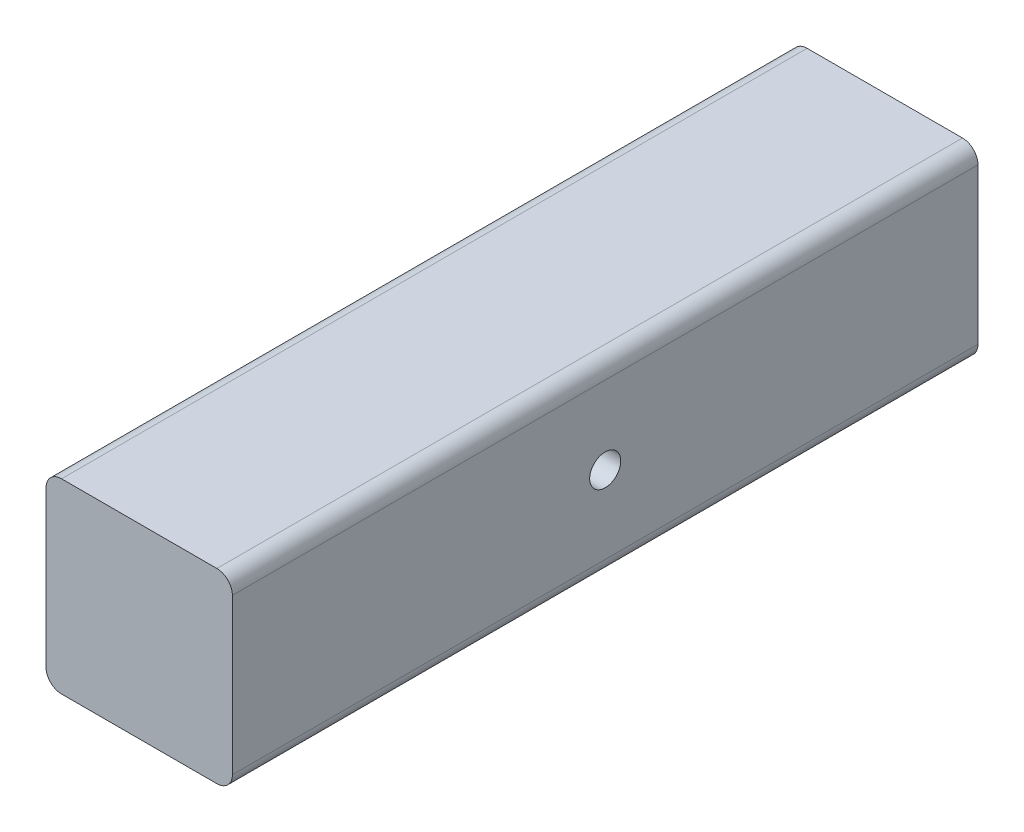
ISO-10303-21;
HEADER;
FILE_DESCRIPTION(('STEP AP214'),'2;1');
FILE_NAME('part.step','',(''),(''),'','','');
FILE_SCHEMA(('AUTOMOTIVE_DESIGN { 1 0 10303 214 1 1 1 1 }'));
ENDSEC;
DATA;
#1=APPLICATION_CONTEXT('core data for automotive mechanical design processes');
#2=APPLICATION_PROTOCOL_DEFINITION('international standard','automotive_design',2000,#1);
#3=PRODUCT_CONTEXT('',#1,'mechanical');
#4=PRODUCT('Part','Part','',(#3));
#5=PRODUCT_RELATED_PRODUCT_CATEGORY('part','',(#4));
#6=PRODUCT_DEFINITION_FORMATION('','',#4);
#7=PRODUCT_DEFINITION_CONTEXT('part definition',#1,'design');
#8=PRODUCT_DEFINITION('design','',#6,#7);
#9=PRODUCT_DEFINITION_SHAPE('','',#8);
#10=(LENGTH_UNIT() NAMED_UNIT(*) SI_UNIT(.MILLI.,.METRE.));
#11=(NAMED_UNIT(*) PLANE_ANGLE_UNIT() SI_UNIT($,.RADIAN.));
#12=(NAMED_UNIT(*) SI_UNIT($,.STERADIAN.) SOLID_ANGLE_UNIT());
#13=UNCERTAINTY_MEASURE_WITH_UNIT(LENGTH_MEASURE(1.E-05),#10,'distance_accuracy_value','');
#14=(GEOMETRIC_REPRESENTATION_CONTEXT(3) GLOBAL_UNCERTAINTY_ASSIGNED_CONTEXT((#13)) GLOBAL_UNIT_ASSIGNED_CONTEXT((#10,
#11,#12)) REPRESENTATION_CONTEXT('',''));
#15=CARTESIAN_POINT('',(0.,0.,0.));
#16=DIRECTION('',(0.,0.,1.));
#17=DIRECTION('',(1.,0.,0.));
#18=AXIS2_PLACEMENT_3D('',#15,#16,#17);
#19=CARTESIAN_POINT('',(19.05,-19.05,152.4));
#20=DIRECTION('',(-1.,0.,0.));
#21=DIRECTION('',(0.,0.,1.));
#22=AXIS2_PLACEMENT_3D('',#19,#20,#21);
#23=PLANE('',#22);
#24=CARTESIAN_POINT('',(19.05,0.,76.2));
#25=DIRECTION('',(-1.,0.,0.));
#26=DIRECTION('',(0.,0.,1.));
#27=AXIS2_PLACEMENT_3D('',#24,#25,#26);
#28=CIRCLE('',#27,3.175);
#29=CARTESIAN_POINT('',(19.05,0.,79.375));
#30=VERTEX_POINT('',#29);
#31=EDGE_CURVE('E177',#30,#30,#28,.T.);
#32=ORIENTED_EDGE('',*,*,#31,.T.);
#33=EDGE_LOOP('',(#32));
#34=FACE_BOUND('',#33,.T.);
#35=DIRECTION('',(0.,1.,0.));
#36=VECTOR('',#35,1.);
#37=CARTESIAN_POINT('',(19.05,-19.05,152.4));
#38=LINE('',#37,#36);
#39=CARTESIAN_POINT('',(19.05,-15.875,152.4));
#40=VERTEX_POINT('',#39);
#41=CARTESIAN_POINT('',(19.05,15.875,152.4));
#42=VERTEX_POINT('',#41);
#43=EDGE_CURVE('E134',#40,#42,#38,.T.);
#44=ORIENTED_EDGE('',*,*,#43,.F.);
#45=DIRECTION('',(0.,0.,-1.));
#46=VECTOR('',#45,1.);
#47=CARTESIAN_POINT('',(19.05,-15.875,152.4));
#48=LINE('',#47,#46);
#49=CARTESIAN_POINT('',(19.05,-15.875,0.));
#50=VERTEX_POINT('',#49);
#51=EDGE_CURVE('E11',#40,#50,#48,.T.);
#52=ORIENTED_EDGE('',*,*,#51,.T.);
#53=DIRECTION('',(0.,1.,0.));
#54=VECTOR('',#53,1.);
#55=CARTESIAN_POINT('',(19.05,-19.05,0.));
#56=LINE('',#55,#54);
#57=CARTESIAN_POINT('',(19.05,15.875,0.));
#58=VERTEX_POINT('',#57);
#59=EDGE_CURVE('E136',#50,#58,#56,.T.);
#60=ORIENTED_EDGE('',*,*,#59,.T.);
#61=DIRECTION('',(0.,0.,-1.));
#62=VECTOR('',#61,1.);
#63=CARTESIAN_POINT('',(19.05,15.875,152.4));
#64=LINE('',#63,#62);
#65=EDGE_CURVE('E47',#58,#42,#64,.F.);
#66=ORIENTED_EDGE('',*,*,#65,.T.);
#67=EDGE_LOOP('',(#44,#52,#60,#66));
#68=FACE_BOUND('',#67,.T.);
#69=ADVANCED_FACE('F39',(#34,#68),#23,.F.);
#70=CARTESIAN_POINT('',(-19.05,19.05,152.4));
#71=DIRECTION('',(0.,-1.,0.));
#72=DIRECTION('',(0.,0.,-1.));
#73=AXIS2_PLACEMENT_3D('',#70,#71,#72);
#74=PLANE('',#73);
#75=DIRECTION('',(-1.,0.,0.));
#76=VECTOR('',#75,1.);
#77=CARTESIAN_POINT('',(-19.05,19.05,0.));
#78=LINE('',#77,#76);
#79=CARTESIAN_POINT('',(15.875,19.05,0.));
#80=VERTEX_POINT('',#79);
#81=CARTESIAN_POINT('',(-15.875,19.05,0.));
#82=VERTEX_POINT('',#81);
#83=EDGE_CURVE('E132',#80,#82,#78,.T.);
#84=ORIENTED_EDGE('',*,*,#83,.T.);
#85=DIRECTION('',(0.,0.,-1.));
#86=VECTOR('',#85,1.);
#87=CARTESIAN_POINT('',(-15.875,19.05,152.4));
#88=LINE('',#87,#86);
#89=CARTESIAN_POINT('',(-15.875,19.05,152.4));
#90=VERTEX_POINT('',#89);
#91=EDGE_CURVE('E111',#82,#90,#88,.F.);
#92=ORIENTED_EDGE('',*,*,#91,.T.);
#93=DIRECTION('',(-1.,0.,0.));
#94=VECTOR('',#93,1.);
#95=CARTESIAN_POINT('',(-19.05,19.05,152.4));
#96=LINE('',#95,#94);
#97=CARTESIAN_POINT('',(15.875,19.05,152.4));
#98=VERTEX_POINT('',#97);
#99=EDGE_CURVE('E172',#98,#90,#96,.T.);
#100=ORIENTED_EDGE('',*,*,#99,.F.);
#101=DIRECTION('',(0.,0.,-1.));
#102=VECTOR('',#101,1.);
#103=CARTESIAN_POINT('',(15.875,19.05,152.4));
#104=LINE('',#103,#102);
#105=EDGE_CURVE('E116',#98,#80,#104,.T.);
#106=ORIENTED_EDGE('',*,*,#105,.T.);
#107=EDGE_LOOP('',(#84,#92,#100,#106));
#108=FACE_BOUND('',#107,.T.);
#109=ADVANCED_FACE('F176',(#108),#74,.F.);
#110=CARTESIAN_POINT('',(-19.05,-19.05,152.4));
#111=DIRECTION('',(1.,0.,0.));
#112=DIRECTION('',(0.,0.,-1.));
#113=AXIS2_PLACEMENT_3D('',#110,#111,#112);
#114=PLANE('',#113);
#115=CARTESIAN_POINT('',(-19.05,0.,76.2));
#116=DIRECTION('',(-1.,0.,0.));
#117=DIRECTION('',(0.,0.,1.));
#118=AXIS2_PLACEMENT_3D('',#115,#116,#117);
#119=CIRCLE('',#118,3.175);
#120=CARTESIAN_POINT('',(-19.05,0.,79.375));
#121=VERTEX_POINT('',#120);
#122=EDGE_CURVE('E179',#121,#121,#119,.T.);
#123=ORIENTED_EDGE('',*,*,#122,.F.);
#124=EDGE_LOOP('',(#123));
#125=FACE_BOUND('',#124,.T.);
#126=DIRECTION('',(0.,-1.,0.));
#127=VECTOR('',#126,1.);
#128=CARTESIAN_POINT('',(-19.05,-19.05,152.4));
#129=LINE('',#128,#127);
#130=CARTESIAN_POINT('',(-19.05,15.875,152.4));
#131=VERTEX_POINT('',#130);
#132=CARTESIAN_POINT('',(-19.05,-15.875,152.4));
#133=VERTEX_POINT('',#132);
#134=EDGE_CURVE('E125',#131,#133,#129,.T.);
#135=ORIENTED_EDGE('',*,*,#134,.F.);
#136=DIRECTION('',(0.,0.,-1.));
#137=VECTOR('',#136,1.);
#138=CARTESIAN_POINT('',(-19.05,15.875,152.4));
#139=LINE('',#138,#137);
#140=CARTESIAN_POINT('',(-19.05,15.875,0.));
#141=VERTEX_POINT('',#140);
#142=EDGE_CURVE('E110',#131,#141,#139,.T.);
#143=ORIENTED_EDGE('',*,*,#142,.T.);
#144=DIRECTION('',(0.,-1.,0.));
#145=VECTOR('',#144,1.);
#146=CARTESIAN_POINT('',(-19.05,-19.05,0.));
#147=LINE('',#146,#145);
#148=CARTESIAN_POINT('',(-19.05,-15.875,0.));
#149=VERTEX_POINT('',#148);
#150=EDGE_CURVE('E123',#141,#149,#147,.T.);
#151=ORIENTED_EDGE('',*,*,#150,.T.);
#152=DIRECTION('',(0.,0.,-1.));
#153=VECTOR('',#152,1.);
#154=CARTESIAN_POINT('',(-19.05,-15.875,152.4));
#155=LINE('',#154,#153);
#156=EDGE_CURVE('E127',#149,#133,#155,.F.);
#157=ORIENTED_EDGE('',*,*,#156,.T.);
#158=EDGE_LOOP('',(#135,#143,#151,#157));
#159=FACE_BOUND('',#158,.T.);
#160=ADVANCED_FACE('F122',(#125,#159),#114,.F.);
#161=CARTESIAN_POINT('',(-19.05,-19.05,152.4));
#162=DIRECTION('',(0.,1.,0.));
#163=DIRECTION('',(0.,0.,1.));
#164=AXIS2_PLACEMENT_3D('',#161,#162,#163);
#165=PLANE('',#164);
#166=DIRECTION('',(1.,0.,0.));
#167=VECTOR('',#166,1.);
#168=CARTESIAN_POINT('',(-19.05,-19.05,152.4));
#169=LINE('',#168,#167);
#170=CARTESIAN_POINT('',(-15.875,-19.05,152.4));
#171=VERTEX_POINT('',#170);
#172=CARTESIAN_POINT('',(15.875,-19.05,152.4));
#173=VERTEX_POINT('',#172);
#174=EDGE_CURVE('E140',#171,#173,#169,.T.);
#175=ORIENTED_EDGE('',*,*,#174,.F.);
#176=DIRECTION('',(0.,0.,-1.));
#177=VECTOR('',#176,1.);
#178=CARTESIAN_POINT('',(-15.875,-19.05,152.4));
#179=LINE('',#178,#177);
#180=CARTESIAN_POINT('',(-15.875,-19.05,0.));
#181=VERTEX_POINT('',#180);
#182=EDGE_CURVE('E157',#171,#181,#179,.T.);
#183=ORIENTED_EDGE('',*,*,#182,.T.);
#184=DIRECTION('',(1.,0.,0.));
#185=VECTOR('',#184,1.);
#186=CARTESIAN_POINT('',(-19.05,-19.05,0.));
#187=LINE('',#186,#185);
#188=CARTESIAN_POINT('',(15.875,-19.05,0.));
#189=VERTEX_POINT('',#188);
#190=EDGE_CURVE('E131',#181,#189,#187,.T.);
#191=ORIENTED_EDGE('',*,*,#190,.T.);
#192=DIRECTION('',(0.,0.,-1.));
#193=VECTOR('',#192,1.);
#194=CARTESIAN_POINT('',(15.875,-19.05,152.4));
#195=LINE('',#194,#193);
#196=EDGE_CURVE('E54',#189,#173,#195,.F.);
#197=ORIENTED_EDGE('',*,*,#196,.T.);
#198=EDGE_LOOP('',(#175,#183,#191,#197));
#199=FACE_BOUND('',#198,.T.);
#200=ADVANCED_FACE('F191',(#199),#165,.F.);
#201=CARTESIAN_POINT('',(0.,0.,152.4));
#202=DIRECTION('',(0.,0.,-1.));
#203=DIRECTION('',(-1.,0.,0.));
#204=AXIS2_PLACEMENT_3D('',#201,#202,#203);
#205=PLANE('',#204);
#206=ORIENTED_EDGE('',*,*,#99,.T.);
#207=CARTESIAN_POINT('',(-15.875,15.875,152.4));
#208=DIRECTION('',(0.,0.,-1.));
#209=DIRECTION('',(-1.,0.,0.));
#210=AXIS2_PLACEMENT_3D('',#207,#208,#209);
#211=CIRCLE('',#210,3.175);
#212=EDGE_CURVE('E154',#90,#131,#211,.F.);
#213=ORIENTED_EDGE('',*,*,#212,.T.);
#214=ORIENTED_EDGE('',*,*,#134,.T.);
#215=CARTESIAN_POINT('',(-15.875,-15.875,152.4));
#216=DIRECTION('',(0.,0.,-1.));
#217=DIRECTION('',(-1.,0.,0.));
#218=AXIS2_PLACEMENT_3D('',#215,#216,#217);
#219=CIRCLE('',#218,3.175);
#220=EDGE_CURVE('E61',#133,#171,#219,.F.);
#221=ORIENTED_EDGE('',*,*,#220,.T.);
#222=ORIENTED_EDGE('',*,*,#174,.T.);
#223=CARTESIAN_POINT('',(15.875,-15.875,152.4));
#224=DIRECTION('',(0.,0.,-1.));
#225=DIRECTION('',(-1.,0.,0.));
#226=AXIS2_PLACEMENT_3D('',#223,#224,#225);
#227=CIRCLE('',#226,3.175);
#228=EDGE_CURVE('E151',#173,#40,#227,.F.);
#229=ORIENTED_EDGE('',*,*,#228,.T.);
#230=ORIENTED_EDGE('',*,*,#43,.T.);
#231=CARTESIAN_POINT('',(15.875,15.875,152.4));
#232=DIRECTION('',(0.,0.,-1.));
#233=DIRECTION('',(-1.,0.,0.));
#234=AXIS2_PLACEMENT_3D('',#231,#232,#233);
#235=CIRCLE('',#234,3.175);
#236=EDGE_CURVE('E149',#42,#98,#235,.F.);
#237=ORIENTED_EDGE('',*,*,#236,.T.);
#238=EDGE_LOOP('',(#206,#213,#214,#221,#222,#229,#230,#237));
#239=FACE_BOUND('',#238,.T.);
#240=ADVANCED_FACE('F169',(#239),#205,.F.);
#241=CARTESIAN_POINT('',(0.,0.,0.));
#242=DIRECTION('',(0.,0.,-1.));
#243=DIRECTION('',(-1.,0.,0.));
#244=AXIS2_PLACEMENT_3D('',#241,#242,#243);
#245=PLANE('',#244);
#246=ORIENTED_EDGE('',*,*,#150,.F.);
#247=CARTESIAN_POINT('',(-15.875,15.875,0.));
#248=DIRECTION('',(0.,0.,-1.));
#249=DIRECTION('',(-1.,0.,0.));
#250=AXIS2_PLACEMENT_3D('',#247,#248,#249);
#251=CIRCLE('',#250,3.175);
#252=EDGE_CURVE('E106',#141,#82,#251,.T.);
#253=ORIENTED_EDGE('',*,*,#252,.T.);
#254=ORIENTED_EDGE('',*,*,#83,.F.);
#255=CARTESIAN_POINT('',(15.875,15.875,0.));
#256=DIRECTION('',(0.,0.,-1.));
#257=DIRECTION('',(-1.,0.,0.));
#258=AXIS2_PLACEMENT_3D('',#255,#256,#257);
#259=CIRCLE('',#258,3.175);
#260=EDGE_CURVE('E126',#80,#58,#259,.T.);
#261=ORIENTED_EDGE('',*,*,#260,.T.);
#262=ORIENTED_EDGE('',*,*,#59,.F.);
#263=CARTESIAN_POINT('',(15.875,-15.875,0.));
#264=DIRECTION('',(0.,0.,-1.));
#265=DIRECTION('',(-1.,0.,0.));
#266=AXIS2_PLACEMENT_3D('',#263,#264,#265);
#267=CIRCLE('',#266,3.175);
#268=EDGE_CURVE('E143',#50,#189,#267,.T.);
#269=ORIENTED_EDGE('',*,*,#268,.T.);
#270=ORIENTED_EDGE('',*,*,#190,.F.);
#271=CARTESIAN_POINT('',(-15.875,-15.875,0.));
#272=DIRECTION('',(0.,0.,-1.));
#273=DIRECTION('',(-1.,0.,0.));
#274=AXIS2_PLACEMENT_3D('',#271,#272,#273);
#275=CIRCLE('',#274,3.175);
#276=EDGE_CURVE('E117',#181,#149,#275,.T.);
#277=ORIENTED_EDGE('',*,*,#276,.T.);
#278=EDGE_LOOP('',(#246,#253,#254,#261,#262,#269,#270,#277));
#279=FACE_BOUND('',#278,.T.);
#280=ADVANCED_FACE('F129',(#279),#245,.T.);
#281=CARTESIAN_POINT('',(-15.875,15.875,152.4));
#282=DIRECTION('',(0.,0.,-1.));
#283=DIRECTION('',(-1.,0.,0.));
#284=AXIS2_PLACEMENT_3D('',#281,#282,#283);
#285=CYLINDRICAL_SURFACE('',#284,3.175);
#286=ORIENTED_EDGE('',*,*,#212,.F.);
#287=ORIENTED_EDGE('',*,*,#91,.F.);
#288=ORIENTED_EDGE('',*,*,#252,.F.);
#289=ORIENTED_EDGE('',*,*,#142,.F.);
#290=EDGE_LOOP('',(#286,#287,#288,#289));
#291=FACE_BOUND('',#290,.T.);
#292=ADVANCED_FACE('F109',(#291),#285,.T.);
#293=CARTESIAN_POINT('',(-15.875,-15.875,152.4));
#294=DIRECTION('',(0.,0.,-1.));
#295=DIRECTION('',(-1.,0.,0.));
#296=AXIS2_PLACEMENT_3D('',#293,#294,#295);
#297=CYLINDRICAL_SURFACE('',#296,3.175);
#298=ORIENTED_EDGE('',*,*,#220,.F.);
#299=ORIENTED_EDGE('',*,*,#156,.F.);
#300=ORIENTED_EDGE('',*,*,#276,.F.);
#301=ORIENTED_EDGE('',*,*,#182,.F.);
#302=EDGE_LOOP('',(#298,#299,#300,#301));
#303=FACE_BOUND('',#302,.T.);
#304=ADVANCED_FACE('F209',(#303),#297,.T.);
#305=CARTESIAN_POINT('',(15.875,-15.875,152.4));
#306=DIRECTION('',(0.,0.,-1.));
#307=DIRECTION('',(-1.,0.,0.));
#308=AXIS2_PLACEMENT_3D('',#305,#306,#307);
#309=CYLINDRICAL_SURFACE('',#308,3.175);
#310=ORIENTED_EDGE('',*,*,#228,.F.);
#311=ORIENTED_EDGE('',*,*,#196,.F.);
#312=ORIENTED_EDGE('',*,*,#268,.F.);
#313=ORIENTED_EDGE('',*,*,#51,.F.);
#314=EDGE_LOOP('',(#310,#311,#312,#313));
#315=FACE_BOUND('',#314,.T.);
#316=ADVANCED_FACE('F211',(#315),#309,.T.);
#317=CARTESIAN_POINT('',(15.875,15.875,152.4));
#318=DIRECTION('',(0.,0.,-1.));
#319=DIRECTION('',(-1.,0.,0.));
#320=AXIS2_PLACEMENT_3D('',#317,#318,#319);
#321=CYLINDRICAL_SURFACE('',#320,3.175);
#322=ORIENTED_EDGE('',*,*,#236,.F.);
#323=ORIENTED_EDGE('',*,*,#65,.F.);
#324=ORIENTED_EDGE('',*,*,#260,.F.);
#325=ORIENTED_EDGE('',*,*,#105,.F.);
#326=EDGE_LOOP('',(#322,#323,#324,#325));
#327=FACE_BOUND('',#326,.T.);
#328=ADVANCED_FACE('F41',(#327),#321,.T.);
#329=CARTESIAN_POINT('',(19.05,0.,76.2));
#330=DIRECTION('',(-1.,0.,0.));
#331=DIRECTION('',(0.,0.,1.));
#332=AXIS2_PLACEMENT_3D('',#329,#330,#331);
#333=CYLINDRICAL_SURFACE('',#332,3.175);
#334=CARTESIAN_POINT('',(19.05,0.,79.375));
#335=CARTESIAN_POINT('',(18.653125,0.,79.375));
#336=CARTESIAN_POINT('',(18.25625,0.,79.375));
#337=CARTESIAN_POINT('',(17.4625,0.,79.375));
#338=CARTESIAN_POINT('',(17.065625,0.,79.375));
#339=CARTESIAN_POINT('',(16.271875,0.,79.375));
#340=CARTESIAN_POINT('',(15.875,0.,79.375));
#341=CARTESIAN_POINT('',(15.08125,0.,79.375));
#342=CARTESIAN_POINT('',(14.684375,0.,79.375));
#343=CARTESIAN_POINT('',(13.890625,0.,79.375));
#344=CARTESIAN_POINT('',(13.49375,0.,79.375));
#345=CARTESIAN_POINT('',(12.7,0.,79.375));
#346=CARTESIAN_POINT('',(12.303125,0.,79.375));
#347=CARTESIAN_POINT('',(11.509375,0.,79.375));
#348=CARTESIAN_POINT('',(11.1125,0.,79.375));
#349=CARTESIAN_POINT('',(10.31875,0.,79.375));
#350=CARTESIAN_POINT('',(9.92187500000001,0.,79.375));
#351=CARTESIAN_POINT('',(9.12812500000001,0.,79.375));
#352=CARTESIAN_POINT('',(8.73125,0.,79.375));
#353=CARTESIAN_POINT('',(7.93750000000001,0.,79.375));
#354=CARTESIAN_POINT('',(7.540625,0.,79.375));
#355=CARTESIAN_POINT('',(6.746875,0.,79.375));
#356=CARTESIAN_POINT('',(6.35,0.,79.375));
#357=CARTESIAN_POINT('',(5.55625,0.,79.375));
#358=CARTESIAN_POINT('',(5.15937500000001,0.,79.375));
#359=CARTESIAN_POINT('',(4.365625,0.,79.375));
#360=CARTESIAN_POINT('',(3.96875,0.,79.375));
#361=CARTESIAN_POINT('',(3.17500000000001,0.,79.375));
#362=CARTESIAN_POINT('',(2.77812500000001,0.,79.375));
#363=CARTESIAN_POINT('',(1.98437500000001,0.,79.375));
#364=CARTESIAN_POINT('',(1.58750000000001,0.,79.375));
#365=CARTESIAN_POINT('',(0.793750000000007,0.,79.375));
#366=CARTESIAN_POINT('',(0.396875000000007,0.,79.375));
#367=CARTESIAN_POINT('',(-0.396874999999993,0.,79.375));
#368=CARTESIAN_POINT('',(-0.793749999999994,0.,79.375));
#369=CARTESIAN_POINT('',(-1.58749999999999,0.,79.375));
#370=CARTESIAN_POINT('',(-1.98437499999999,0.,79.375));
#371=CARTESIAN_POINT('',(-2.77812499999999,0.,79.375));
#372=CARTESIAN_POINT('',(-3.17499999999999,0.,79.375));
#373=CARTESIAN_POINT('',(-3.96875,0.,79.375));
#374=CARTESIAN_POINT('',(-4.365625,0.,79.375));
#375=CARTESIAN_POINT('',(-5.15937499999999,0.,79.375));
#376=CARTESIAN_POINT('',(-5.55624999999999,0.,79.375));
#377=CARTESIAN_POINT('',(-6.34999999999999,0.,79.375));
#378=CARTESIAN_POINT('',(-6.74687499999999,0.,79.375));
#379=CARTESIAN_POINT('',(-7.54062499999999,0.,79.375));
#380=CARTESIAN_POINT('',(-7.93749999999999,0.,79.375));
#381=CARTESIAN_POINT('',(-8.73124999999999,0.,79.375));
#382=CARTESIAN_POINT('',(-9.128125,0.,79.375));
#383=CARTESIAN_POINT('',(-9.92187499999999,0.,79.375));
#384=CARTESIAN_POINT('',(-10.31875,0.,79.375));
#385=CARTESIAN_POINT('',(-11.1125,0.,79.375));
#386=CARTESIAN_POINT('',(-11.509375,0.,79.375));
#387=CARTESIAN_POINT('',(-12.303125,0.,79.375));
#388=CARTESIAN_POINT('',(-12.7,0.,79.375));
#389=CARTESIAN_POINT('',(-13.49375,0.,79.375));
#390=CARTESIAN_POINT('',(-13.890625,0.,79.375));
#391=CARTESIAN_POINT('',(-14.684375,0.,79.375));
#392=CARTESIAN_POINT('',(-15.08125,0.,79.375));
#393=CARTESIAN_POINT('',(-15.875,0.,79.375));
#394=CARTESIAN_POINT('',(-16.271875,0.,79.375));
#395=CARTESIAN_POINT('',(-17.065625,0.,79.375));
#396=CARTESIAN_POINT('',(-17.4625,0.,79.375));
#397=CARTESIAN_POINT('',(-18.25625,0.,79.375));
#398=CARTESIAN_POINT('',(-18.653125,0.,79.375));
#399=CARTESIAN_POINT('',(-19.05,0.,79.375));
#400=B_SPLINE_CURVE_WITH_KNOTS('',3,(#334,#335,#336,#337,#338,#339,#340,#341,#342,#343,#344,
#345,#346,#347,#348,#349,#350,#351,#352,#353,#354,#355,#356,#357,#358,#359,#360,#361,#362,#363,
#364,#365,#366,#367,#368,#369,#370,#371,#372,#373,#374,#375,#376,#377,#378,#379,#380,#381,#382,
#383,#384,#385,#386,#387,#388,#389,#390,#391,#392,#393,#394,#395,#396,#397,#398,#399),
.UNSPECIFIED.,.F.,.F.,(4,2,2,2,2,2,2,2,2,2,2,2,2,2,2,2,2,2,2,2,2,2,2,2,2,2,2,2,2,2,2,2,4),(0.,
1.190625,2.38125,3.571875,4.7625,5.953125,7.14375,8.334375,9.525,10.715625,11.90625,13.096875,
14.2875,15.478125,16.66875,17.859375,19.05,20.240625,21.43125,22.621875,23.8125,25.003125,
26.19375,27.384375,28.575,29.765625,30.95625,32.146875,33.3375,34.528125,35.71875,36.909375,
38.1),.UNSPECIFIED.);
#401=EDGE_CURVE('BSEAM188',#30,#121,#400,.T.);
#402=ORIENTED_EDGE('',*,*,#31,.F.);
#403=ORIENTED_EDGE('',*,*,#122,.T.);
#404=ORIENTED_EDGE('',*,*,#401,.T.);
#405=ORIENTED_EDGE('',*,*,#401,.F.);
#406=EDGE_LOOP('',(#402,#404,#403,#405));
#407=FACE_BOUND('',#406,.T.);
#408=ADVANCED_FACE('F188',(#407),#333,.F.);
#409=CLOSED_SHELL('',(#69,#109,#160,#200,#240,#280,#292,#304,#316,#328,#408));
#410=MANIFOLD_SOLID_BREP('B2',#409);
#411=ADVANCED_BREP_SHAPE_REPRESENTATION('',(#18,#410),#14);
#412=SHAPE_DEFINITION_REPRESENTATION(#9,#411);
ENDSEC;
END-ISO-10303-21;
